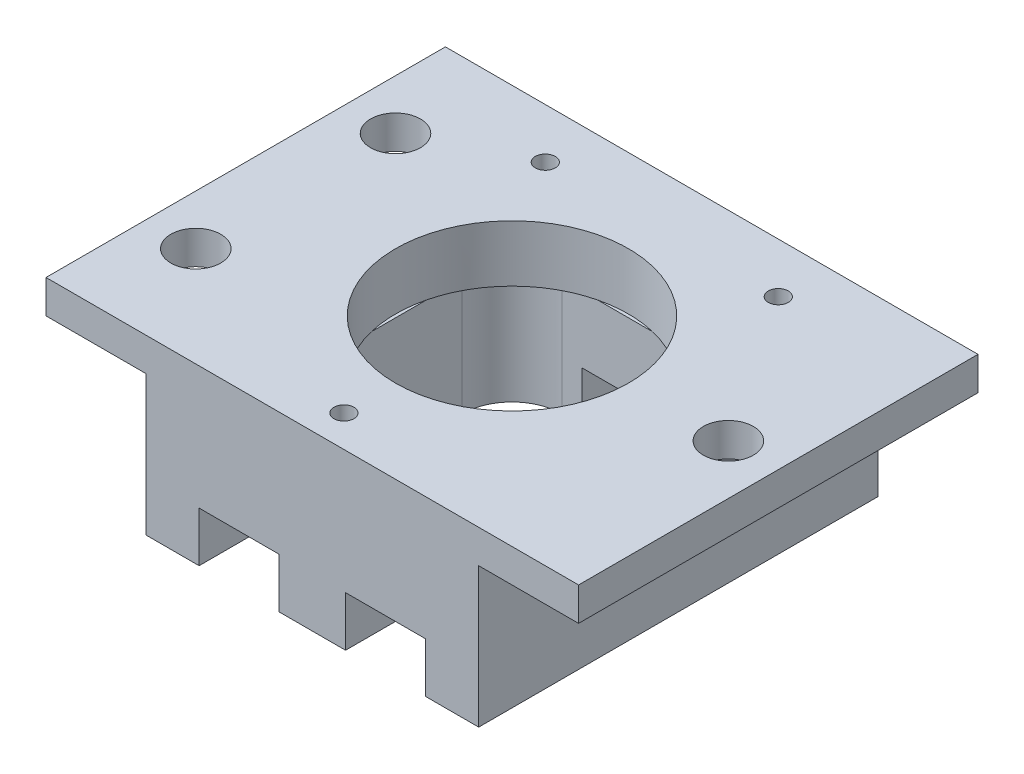
ISO-10303-21;
HEADER;
FILE_DESCRIPTION(('STEP AP214'),'2;1');
FILE_NAME('part.step','',(''),(''),'','','');
FILE_SCHEMA(('AUTOMOTIVE_DESIGN { 1 0 10303 214 1 1 1 1 }'));
ENDSEC;
DATA;
#1=APPLICATION_CONTEXT('core data for automotive mechanical design processes');
#2=APPLICATION_PROTOCOL_DEFINITION('international standard','automotive_design',2000,#1);
#3=PRODUCT_CONTEXT('',#1,'mechanical');
#4=PRODUCT('Part','Part','',(#3));
#5=PRODUCT_RELATED_PRODUCT_CATEGORY('part','',(#4));
#6=PRODUCT_DEFINITION_FORMATION('','',#4);
#7=PRODUCT_DEFINITION_CONTEXT('part definition',#1,'design');
#8=PRODUCT_DEFINITION('design','',#6,#7);
#9=PRODUCT_DEFINITION_SHAPE('','',#8);
#10=(LENGTH_UNIT() NAMED_UNIT(*) SI_UNIT(.MILLI.,.METRE.));
#11=(NAMED_UNIT(*) PLANE_ANGLE_UNIT() SI_UNIT($,.RADIAN.));
#12=(NAMED_UNIT(*) SI_UNIT($,.STERADIAN.) SOLID_ANGLE_UNIT());
#13=UNCERTAINTY_MEASURE_WITH_UNIT(LENGTH_MEASURE(1.E-05),#10,'distance_accuracy_value','');
#14=(GEOMETRIC_REPRESENTATION_CONTEXT(3) GLOBAL_UNCERTAINTY_ASSIGNED_CONTEXT((#13)) GLOBAL_UNIT_ASSIGNED_CONTEXT((#10,
#11,#12)) REPRESENTATION_CONTEXT('',''));
#15=CARTESIAN_POINT('',(0.,0.,0.));
#16=DIRECTION('',(0.,0.,1.));
#17=DIRECTION('',(1.,0.,0.));
#18=AXIS2_PLACEMENT_3D('',#15,#16,#17);
#19=CARTESIAN_POINT('',(0.,-3.5,0.));
#20=DIRECTION('',(0.,1.,0.));
#21=DIRECTION('',(0.,0.,1.));
#22=AXIS2_PLACEMENT_3D('',#19,#20,#21);
#23=PLANE('',#22);
#24=CARTESIAN_POINT('',(3.5,-3.5,-4.5));
#25=DIRECTION('',(0.,1.,0.));
#26=DIRECTION('',(0.,0.,1.));
#27=AXIS2_PLACEMENT_3D('',#24,#25,#26);
#28=CIRCLE('',#27,0.299999999999997);
#29=CARTESIAN_POINT('',(3.5,-3.5,-4.2));
#30=VERTEX_POINT('',#29);
#31=EDGE_CURVE('E311',#30,#30,#28,.T.);
#32=ORIENTED_EDGE('',*,*,#31,.T.);
#33=EDGE_LOOP('',(#32));
#34=FACE_BOUND('',#33,.T.);
#35=DIRECTION('',(0.,0.,-1.));
#36=VECTOR('',#35,1.);
#37=CARTESIAN_POINT('',(1.3,-3.5,0.));
#38=LINE('',#37,#36);
#39=CARTESIAN_POINT('',(1.3,-3.5,-3.4));
#40=VERTEX_POINT('',#39);
#41=CARTESIAN_POINT('',(1.3,-3.5,-6.));
#42=VERTEX_POINT('',#41);
#43=EDGE_CURVE('E308',#40,#42,#38,.T.);
#44=ORIENTED_EDGE('',*,*,#43,.T.);
#45=DIRECTION('',(1.,0.,0.));
#46=VECTOR('',#45,1.);
#47=CARTESIAN_POINT('',(-5.,-3.5,-6.));
#48=LINE('',#47,#46);
#49=CARTESIAN_POINT('',(5.,-3.5,-6.));
#50=VERTEX_POINT('',#49);
#51=EDGE_CURVE('E435',#42,#50,#48,.T.);
#52=ORIENTED_EDGE('',*,*,#51,.T.);
#53=DIRECTION('',(0.,0.,-1.));
#54=VECTOR('',#53,1.);
#55=CARTESIAN_POINT('',(5.,-3.5,6.));
#56=LINE('',#55,#54);
#57=CARTESIAN_POINT('',(5.,-3.5,6.));
#58=VERTEX_POINT('',#57);
#59=EDGE_CURVE('E431',#58,#50,#56,.T.);
#60=ORIENTED_EDGE('',*,*,#59,.F.);
#61=DIRECTION('',(1.,0.,0.));
#62=VECTOR('',#61,1.);
#63=CARTESIAN_POINT('',(-5.,-3.5,6.));
#64=LINE('',#63,#62);
#65=CARTESIAN_POINT('',(3.4,-3.5,6.));
#66=VERTEX_POINT('',#65);
#67=EDGE_CURVE('E427',#66,#58,#64,.T.);
#68=ORIENTED_EDGE('',*,*,#67,.F.);
#69=DIRECTION('',(0.,0.,1.));
#70=VECTOR('',#69,1.);
#71=CARTESIAN_POINT('',(3.4,-3.5,0.));
#72=LINE('',#71,#70);
#73=CARTESIAN_POINT('',(3.4,-3.5,-1.9));
#74=VERTEX_POINT('',#73);
#75=EDGE_CURVE('E270',#74,#66,#72,.T.);
#76=ORIENTED_EDGE('',*,*,#75,.F.);
#77=CARTESIAN_POINT('',(1.9,-3.5,-1.9));
#78=DIRECTION('',(0.,-1.,0.));
#79=DIRECTION('',(0.,0.,-1.));
#80=AXIS2_PLACEMENT_3D('',#77,#78,#79);
#81=CIRCLE('',#80,1.5);
#82=CARTESIAN_POINT('',(1.9,-3.5,-3.4));
#83=VERTEX_POINT('',#82);
#84=EDGE_CURVE('E391',#83,#74,#81,.T.);
#85=ORIENTED_EDGE('',*,*,#84,.F.);
#86=DIRECTION('',(-1.,0.,0.));
#87=VECTOR('',#86,1.);
#88=CARTESIAN_POINT('',(0.,-3.5,-3.4));
#89=LINE('',#88,#87);
#90=EDGE_CURVE('E388',#83,#40,#89,.T.);
#91=ORIENTED_EDGE('',*,*,#90,.T.);
#92=EDGE_LOOP('',(#44,#52,#60,#68,#76,#85,#91));
#93=FACE_BOUND('',#92,.T.);
#94=ADVANCED_FACE('F80',(#34,#93),#23,.F.);
#95=CARTESIAN_POINT('',(0.,-3.5,5.05));
#96=DIRECTION('',(0.,1.,0.));
#97=DIRECTION('',(0.,0.,1.));
#98=AXIS2_PLACEMENT_3D('',#95,#96,#97);
#99=CIRCLE('',#98,0.3);
#100=CARTESIAN_POINT('',(0.,-3.5,5.35));
#101=VERTEX_POINT('',#100);
#102=EDGE_CURVE('E471',#101,#101,#99,.T.);
#103=ORIENTED_EDGE('',*,*,#102,.T.);
#104=EDGE_LOOP('',(#103));
#105=FACE_BOUND('',#104,.T.);
#106=DIRECTION('',(0.,0.,1.));
#107=VECTOR('',#106,1.);
#108=CARTESIAN_POINT('',(1.,-3.5,0.));
#109=LINE('',#108,#107);
#110=CARTESIAN_POINT('',(1.,-3.5,4.1));
#111=VERTEX_POINT('',#110);
#112=CARTESIAN_POINT('',(1.,-3.5,6.));
#113=VERTEX_POINT('',#112);
#114=EDGE_CURVE('E281',#111,#113,#109,.T.);
#115=ORIENTED_EDGE('',*,*,#114,.T.);
#116=CARTESIAN_POINT('',(-1.,-3.5,6.));
#117=VERTEX_POINT('',#116);
#118=EDGE_CURVE('E432',#117,#113,#64,.T.);
#119=ORIENTED_EDGE('',*,*,#118,.F.);
#120=DIRECTION('',(0.,0.,1.));
#121=VECTOR('',#120,1.);
#122=CARTESIAN_POINT('',(-1.,-3.5,0.));
#123=LINE('',#122,#121);
#124=CARTESIAN_POINT('',(-1.,-3.5,4.1));
#125=VERTEX_POINT('',#124);
#126=EDGE_CURVE('E296',#125,#117,#123,.T.);
#127=ORIENTED_EDGE('',*,*,#126,.F.);
#128=DIRECTION('',(-1.,0.,0.));
#129=VECTOR('',#128,1.);
#130=CARTESIAN_POINT('',(0.,-3.5,4.1));
#131=LINE('',#130,#129);
#132=EDGE_CURVE('E394',#111,#125,#131,.T.);
#133=ORIENTED_EDGE('',*,*,#132,.F.);
#134=EDGE_LOOP('',(#115,#119,#127,#133));
#135=FACE_BOUND('',#134,.T.);
#136=ADVANCED_FACE('F555',(#105,#135),#23,.F.);
#137=CARTESIAN_POINT('',(0.,-3.5,4.1));
#138=DIRECTION('',(0.,0.,-1.));
#139=DIRECTION('',(-1.,0.,0.));
#140=AXIS2_PLACEMENT_3D('',#137,#138,#139);
#141=PLANE('',#140);
#142=DIRECTION('',(-1.,0.,0.));
#143=VECTOR('',#142,1.);
#144=CARTESIAN_POINT('',(0.,-2.,4.1));
#145=LINE('',#144,#143);
#146=CARTESIAN_POINT('',(3.4,-2.,4.1));
#147=VERTEX_POINT('',#146);
#148=CARTESIAN_POINT('',(1.,-2.,4.1));
#149=VERTEX_POINT('',#148);
#150=EDGE_CURVE('E275',#147,#149,#145,.T.);
#151=ORIENTED_EDGE('',*,*,#150,.T.);
#152=DIRECTION('',(0.,-1.,0.));
#153=VECTOR('',#152,1.);
#154=CARTESIAN_POINT('',(1.,-2.,4.1));
#155=LINE('',#154,#153);
#156=EDGE_CURVE('E293',#149,#111,#155,.T.);
#157=ORIENTED_EDGE('',*,*,#156,.T.);
#158=ORIENTED_EDGE('',*,*,#132,.T.);
#159=DIRECTION('',(0.,-1.,0.));
#160=VECTOR('',#159,1.);
#161=CARTESIAN_POINT('',(-1.,-2.,4.1));
#162=LINE('',#161,#160);
#163=CARTESIAN_POINT('',(-1.,-2.,4.1));
#164=VERTEX_POINT('',#163);
#165=EDGE_CURVE('E338',#164,#125,#162,.T.);
#166=ORIENTED_EDGE('',*,*,#165,.F.);
#167=DIRECTION('',(-1.,0.,0.));
#168=VECTOR('',#167,1.);
#169=CARTESIAN_POINT('',(0.,-2.,4.1));
#170=LINE('',#169,#168);
#171=CARTESIAN_POINT('',(-3.4,-2.,4.1));
#172=VERTEX_POINT('',#171);
#173=EDGE_CURVE('E326',#164,#172,#170,.T.);
#174=ORIENTED_EDGE('',*,*,#173,.T.);
#175=DIRECTION('',(0.,1.,0.));
#176=VECTOR('',#175,1.);
#177=CARTESIAN_POINT('',(-3.4,-3.5,4.1));
#178=LINE('',#177,#176);
#179=CARTESIAN_POINT('',(-3.4,0.,4.1));
#180=VERTEX_POINT('',#179);
#181=EDGE_CURVE('E397',#172,#180,#178,.T.);
#182=ORIENTED_EDGE('',*,*,#181,.T.);
#183=DIRECTION('',(-1.,0.,0.));
#184=VECTOR('',#183,1.);
#185=CARTESIAN_POINT('',(0.,0.,4.1));
#186=LINE('',#185,#184);
#187=CARTESIAN_POINT('',(3.4,0.,4.1));
#188=VERTEX_POINT('',#187);
#189=EDGE_CURVE('E384',#188,#180,#186,.T.);
#190=ORIENTED_EDGE('',*,*,#189,.F.);
#191=DIRECTION('',(0.,1.,0.));
#192=VECTOR('',#191,1.);
#193=CARTESIAN_POINT('',(3.4,-3.5,4.1));
#194=LINE('',#193,#192);
#195=EDGE_CURVE('E416',#147,#188,#194,.T.);
#196=ORIENTED_EDGE('',*,*,#195,.F.);
#197=EDGE_LOOP('',(#151,#157,#158,#166,#174,#182,#190,#196));
#198=FACE_BOUND('',#197,.T.);
#199=ADVANCED_FACE('F560',(#198),#141,.T.);
#200=CARTESIAN_POINT('',(-5.,1.7,6.));
#201=DIRECTION('',(-1.,0.,0.));
#202=DIRECTION('',(0.,0.,1.));
#203=AXIS2_PLACEMENT_3D('',#200,#201,#202);
#204=PLANE('',#203);
#205=DIRECTION('',(0.,-1.,0.));
#206=VECTOR('',#205,1.);
#207=CARTESIAN_POINT('',(-5.,1.7,6.));
#208=LINE('',#207,#206);
#209=CARTESIAN_POINT('',(-5.,0.7,6.));
#210=VERTEX_POINT('',#209);
#211=CARTESIAN_POINT('',(-5.,-3.5,6.));
#212=VERTEX_POINT('',#211);
#213=EDGE_CURVE('E454',#210,#212,#208,.T.);
#214=ORIENTED_EDGE('',*,*,#213,.F.);
#215=DIRECTION('',(0.,0.,-1.));
#216=VECTOR('',#215,1.);
#217=CARTESIAN_POINT('',(-5.,0.7,0.));
#218=LINE('',#217,#216);
#219=CARTESIAN_POINT('',(-5.,0.7,-6.));
#220=VERTEX_POINT('',#219);
#221=EDGE_CURVE('E365',#210,#220,#218,.T.);
#222=ORIENTED_EDGE('',*,*,#221,.T.);
#223=DIRECTION('',(0.,-1.,0.));
#224=VECTOR('',#223,1.);
#225=CARTESIAN_POINT('',(-5.,1.7,-6.));
#226=LINE('',#225,#224);
#227=CARTESIAN_POINT('',(-5.,-3.5,-6.));
#228=VERTEX_POINT('',#227);
#229=EDGE_CURVE('E453',#220,#228,#226,.T.);
#230=ORIENTED_EDGE('',*,*,#229,.T.);
#231=DIRECTION('',(0.,0.,-1.));
#232=VECTOR('',#231,1.);
#233=CARTESIAN_POINT('',(-5.,-3.5,6.));
#234=LINE('',#233,#232);
#235=EDGE_CURVE('E439',#212,#228,#234,.T.);
#236=ORIENTED_EDGE('',*,*,#235,.F.);
#237=EDGE_LOOP('',(#214,#222,#230,#236));
#238=FACE_BOUND('',#237,.T.);
#239=ADVANCED_FACE('F82',(#238),#204,.T.);
#240=CARTESIAN_POINT('',(0.,0.,0.));
#241=DIRECTION('',(0.,-1.,0.));
#242=DIRECTION('',(0.,0.,-1.));
#243=AXIS2_PLACEMENT_3D('',#240,#241,#242);
#244=PLANE('',#243);
#245=DIRECTION('',(0.,0.,1.));
#246=VECTOR('',#245,1.);
#247=CARTESIAN_POINT('',(-3.4,0.,0.));
#248=LINE('',#247,#246);
#249=CARTESIAN_POINT('',(-3.4,0.,-1.9));
#250=VERTEX_POINT('',#249);
#251=CARTESIAN_POINT('',(-3.4,0.,-0.830662386291808));
#252=VERTEX_POINT('',#251);
#253=EDGE_CURVE('E398',#250,#252,#248,.T.);
#254=ORIENTED_EDGE('',*,*,#253,.F.);
#255=CARTESIAN_POINT('',(-1.9,0.,-1.9));
#256=DIRECTION('',(0.,-1.,0.));
#257=DIRECTION('',(0.,0.,-1.));
#258=AXIS2_PLACEMENT_3D('',#255,#256,#257);
#259=CIRCLE('',#258,1.5);
#260=CARTESIAN_POINT('',(-1.9,0.,-3.4));
#261=VERTEX_POINT('',#260);
#262=EDGE_CURVE('E401',#250,#261,#259,.T.);
#263=ORIENTED_EDGE('',*,*,#262,.T.);
#264=DIRECTION('',(-1.,0.,0.));
#265=VECTOR('',#264,1.);
#266=CARTESIAN_POINT('',(0.,0.,-3.4));
#267=LINE('',#266,#265);
#268=CARTESIAN_POINT('',(-0.830662386291807,0.,-3.4));
#269=VERTEX_POINT('',#268);
#270=EDGE_CURVE('E12',#269,#261,#267,.T.);
#271=ORIENTED_EDGE('',*,*,#270,.F.);
#272=CARTESIAN_POINT('',(0.,0.,0.));
#273=DIRECTION('',(0.,1.,0.));
#274=DIRECTION('',(0.,0.,1.));
#275=AXIS2_PLACEMENT_3D('',#272,#273,#274);
#276=CIRCLE('',#275,3.5);
#277=EDGE_CURVE('E576',#269,#252,#276,.T.);
#278=ORIENTED_EDGE('',*,*,#277,.T.);
#279=EDGE_LOOP('',(#254,#263,#271,#278));
#280=FACE_BOUND('',#279,.T.);
#281=ADVANCED_FACE('F587',(#280),#244,.T.);
#282=CARTESIAN_POINT('',(1.9,0.,-3.4));
#283=VERTEX_POINT('',#282);
#284=CARTESIAN_POINT('',(0.830662386291808,0.,-3.4));
#285=VERTEX_POINT('',#284);
#286=EDGE_CURVE('E91',#283,#285,#267,.T.);
#287=ORIENTED_EDGE('',*,*,#286,.F.);
#288=CARTESIAN_POINT('',(1.9,0.,-1.9));
#289=DIRECTION('',(0.,-1.,0.));
#290=DIRECTION('',(0.,0.,-1.));
#291=AXIS2_PLACEMENT_3D('',#288,#289,#290);
#292=CIRCLE('',#291,1.5);
#293=CARTESIAN_POINT('',(3.4,0.,-1.9));
#294=VERTEX_POINT('',#293);
#295=EDGE_CURVE('E405',#283,#294,#292,.T.);
#296=ORIENTED_EDGE('',*,*,#295,.T.);
#297=DIRECTION('',(0.,0.,1.));
#298=VECTOR('',#297,1.);
#299=CARTESIAN_POINT('',(3.4,0.,0.));
#300=LINE('',#299,#298);
#301=CARTESIAN_POINT('',(3.4,0.,-0.830662386291809));
#302=VERTEX_POINT('',#301);
#303=EDGE_CURVE('E409',#294,#302,#300,.T.);
#304=ORIENTED_EDGE('',*,*,#303,.T.);
#305=EDGE_CURVE('E449',#302,#285,#276,.T.);
#306=ORIENTED_EDGE('',*,*,#305,.T.);
#307=EDGE_LOOP('',(#287,#296,#304,#306));
#308=FACE_BOUND('',#307,.T.);
#309=ADVANCED_FACE('F508',(#308),#244,.T.);
#310=CARTESIAN_POINT('',(0.,1.7,0.));
#311=DIRECTION('',(0.,-1.,0.));
#312=DIRECTION('',(0.,0.,-1.));
#313=AXIS2_PLACEMENT_3D('',#310,#311,#312);
#314=PLANE('',#313);
#315=CARTESIAN_POINT('',(6.5,1.7,0.));
#316=DIRECTION('',(0.,1.,0.));
#317=DIRECTION('',(0.,0.,1.));
#318=AXIS2_PLACEMENT_3D('',#315,#316,#317);
#319=CIRCLE('',#318,0.750000000000001);
#320=CARTESIAN_POINT('',(6.5,1.7,0.750000000000001));
#321=VERTEX_POINT('',#320);
#322=EDGE_CURVE('E466',#321,#321,#319,.T.);
#323=ORIENTED_EDGE('',*,*,#322,.F.);
#324=EDGE_LOOP('',(#323));
#325=FACE_BOUND('',#324,.T.);
#326=CARTESIAN_POINT('',(-6.5,1.7,-3.));
#327=DIRECTION('',(0.,1.,0.));
#328=DIRECTION('',(0.,0.,1.));
#329=AXIS2_PLACEMENT_3D('',#326,#327,#328);
#330=CIRCLE('',#329,0.750000000000001);
#331=CARTESIAN_POINT('',(-6.5,1.7,-2.25));
#332=VERTEX_POINT('',#331);
#333=EDGE_CURVE('E495',#332,#332,#330,.T.);
#334=ORIENTED_EDGE('',*,*,#333,.F.);
#335=EDGE_LOOP('',(#334));
#336=FACE_BOUND('',#335,.T.);
#337=CARTESIAN_POINT('',(-6.5,1.7,3.));
#338=DIRECTION('',(0.,1.,0.));
#339=DIRECTION('',(0.,0.,1.));
#340=AXIS2_PLACEMENT_3D('',#337,#338,#339);
#341=CIRCLE('',#340,0.750000000000001);
#342=CARTESIAN_POINT('',(-6.5,1.7,3.75));
#343=VERTEX_POINT('',#342);
#344=EDGE_CURVE('E492',#343,#343,#341,.T.);
#345=ORIENTED_EDGE('',*,*,#344,.F.);
#346=EDGE_LOOP('',(#345));
#347=FACE_BOUND('',#346,.T.);
#348=CARTESIAN_POINT('',(3.5,1.7,-4.5));
#349=DIRECTION('',(0.,1.,0.));
#350=DIRECTION('',(0.,0.,1.));
#351=AXIS2_PLACEMENT_3D('',#348,#349,#350);
#352=CIRCLE('',#351,0.299999999999997);
#353=CARTESIAN_POINT('',(3.5,1.7,-4.2));
#354=VERTEX_POINT('',#353);
#355=EDGE_CURVE('E489',#354,#354,#352,.T.);
#356=ORIENTED_EDGE('',*,*,#355,.F.);
#357=EDGE_LOOP('',(#356));
#358=FACE_BOUND('',#357,.T.);
#359=CARTESIAN_POINT('',(-3.5,1.7,-4.5));
#360=DIRECTION('',(0.,1.,0.));
#361=DIRECTION('',(0.,0.,1.));
#362=AXIS2_PLACEMENT_3D('',#359,#360,#361);
#363=CIRCLE('',#362,0.3);
#364=CARTESIAN_POINT('',(-3.5,1.7,-4.2));
#365=VERTEX_POINT('',#364);
#366=EDGE_CURVE('E486',#365,#365,#363,.T.);
#367=ORIENTED_EDGE('',*,*,#366,.F.);
#368=EDGE_LOOP('',(#367));
#369=FACE_BOUND('',#368,.T.);
#370=CARTESIAN_POINT('',(0.,1.7,5.05));
#371=DIRECTION('',(0.,1.,0.));
#372=DIRECTION('',(0.,0.,1.));
#373=AXIS2_PLACEMENT_3D('',#370,#371,#372);
#374=CIRCLE('',#373,0.3);
#375=CARTESIAN_POINT('',(0.,1.7,5.35));
#376=VERTEX_POINT('',#375);
#377=EDGE_CURVE('E483',#376,#376,#374,.T.);
#378=ORIENTED_EDGE('',*,*,#377,.F.);
#379=EDGE_LOOP('',(#378));
#380=FACE_BOUND('',#379,.T.);
#381=DIRECTION('',(1.,0.,0.));
#382=VECTOR('',#381,1.);
#383=CARTESIAN_POINT('',(-5.,1.7,-6.));
#384=LINE('',#383,#382);
#385=CARTESIAN_POINT('',(-8.,1.7,-6.));
#386=VERTEX_POINT('',#385);
#387=CARTESIAN_POINT('',(8.,1.7,-6.));
#388=VERTEX_POINT('',#387);
#389=EDGE_CURVE('E446',#386,#388,#384,.T.);
#390=ORIENTED_EDGE('',*,*,#389,.F.);
#391=DIRECTION('',(0.,0.,-1.));
#392=VECTOR('',#391,1.);
#393=CARTESIAN_POINT('',(-8.,1.7,0.));
#394=LINE('',#393,#392);
#395=CARTESIAN_POINT('',(-8.,1.7,6.));
#396=VERTEX_POINT('',#395);
#397=EDGE_CURVE('E361',#396,#386,#394,.T.);
#398=ORIENTED_EDGE('',*,*,#397,.F.);
#399=DIRECTION('',(1.,0.,0.));
#400=VECTOR('',#399,1.);
#401=CARTESIAN_POINT('',(-5.,1.7,6.));
#402=LINE('',#401,#400);
#403=CARTESIAN_POINT('',(8.,1.7,6.));
#404=VERTEX_POINT('',#403);
#405=EDGE_CURVE('E451',#396,#404,#402,.T.);
#406=ORIENTED_EDGE('',*,*,#405,.T.);
#407=DIRECTION('',(0.,0.,-1.));
#408=VECTOR('',#407,1.);
#409=CARTESIAN_POINT('',(8.,1.7,0.));
#410=LINE('',#409,#408);
#411=EDGE_CURVE('E337',#404,#388,#410,.T.);
#412=ORIENTED_EDGE('',*,*,#411,.T.);
#413=EDGE_LOOP('',(#390,#398,#406,#412));
#414=FACE_BOUND('',#413,.T.);
#415=CARTESIAN_POINT('',(0.,1.7,0.));
#416=DIRECTION('',(0.,1.,0.));
#417=DIRECTION('',(0.,0.,1.));
#418=AXIS2_PLACEMENT_3D('',#415,#416,#417);
#419=CIRCLE('',#418,3.5);
#420=CARTESIAN_POINT('',(0.,1.7,3.5));
#421=VERTEX_POINT('',#420);
#422=EDGE_CURVE('E443',#421,#421,#419,.T.);
#423=ORIENTED_EDGE('',*,*,#422,.F.);
#424=EDGE_LOOP('',(#423));
#425=FACE_BOUND('',#424,.T.);
#426=ADVANCED_FACE('F504',(#325,#336,#347,#358,#369,#380,#414,#425),#314,.F.);
#427=CARTESIAN_POINT('',(-3.4,0.,0.830662386291809));
#428=VERTEX_POINT('',#427);
#429=EDGE_CURVE('E89',#428,#180,#248,.T.);
#430=ORIENTED_EDGE('',*,*,#429,.F.);
#431=CARTESIAN_POINT('',(3.4,0.,0.830662386291809));
#432=VERTEX_POINT('',#431);
#433=EDGE_CURVE('E442',#428,#432,#276,.T.);
#434=ORIENTED_EDGE('',*,*,#433,.T.);
#435=EDGE_CURVE('E412',#432,#188,#300,.T.);
#436=ORIENTED_EDGE('',*,*,#435,.T.);
#437=ORIENTED_EDGE('',*,*,#189,.T.);
#438=EDGE_LOOP('',(#430,#434,#436,#437));
#439=FACE_BOUND('',#438,.T.);
#440=ADVANCED_FACE('F507',(#439),#244,.T.);
#441=CARTESIAN_POINT('',(-5.,1.7,6.));
#442=DIRECTION('',(0.,0.,-1.));
#443=DIRECTION('',(-1.,0.,0.));
#444=AXIS2_PLACEMENT_3D('',#441,#442,#443);
#445=PLANE('',#444);
#446=DIRECTION('',(-1.,0.,0.));
#447=VECTOR('',#446,1.);
#448=CARTESIAN_POINT('',(0.,-2.,6.));
#449=LINE('',#448,#447);
#450=CARTESIAN_POINT('',(3.4,-2.,6.));
#451=VERTEX_POINT('',#450);
#452=CARTESIAN_POINT('',(1.,-2.,6.));
#453=VERTEX_POINT('',#452);
#454=EDGE_CURVE('E278',#451,#453,#449,.T.);
#455=ORIENTED_EDGE('',*,*,#454,.F.);
#456=DIRECTION('',(0.,-1.,0.));
#457=VECTOR('',#456,1.);
#458=CARTESIAN_POINT('',(3.4,-2.,6.));
#459=LINE('',#458,#457);
#460=EDGE_CURVE('E262',#451,#66,#459,.T.);
#461=ORIENTED_EDGE('',*,*,#460,.T.);
#462=ORIENTED_EDGE('',*,*,#67,.T.);
#463=DIRECTION('',(0.,-1.,0.));
#464=VECTOR('',#463,1.);
#465=CARTESIAN_POINT('',(5.,1.7,6.));
#466=LINE('',#465,#464);
#467=CARTESIAN_POINT('',(5.,0.7,6.));
#468=VERTEX_POINT('',#467);
#469=EDGE_CURVE('E456',#468,#58,#466,.T.);
#470=ORIENTED_EDGE('',*,*,#469,.F.);
#471=DIRECTION('',(1.,0.,0.));
#472=VECTOR('',#471,1.);
#473=CARTESIAN_POINT('',(0.,0.7,6.));
#474=LINE('',#473,#472);
#475=CARTESIAN_POINT('',(8.,0.7,6.));
#476=VERTEX_POINT('',#475);
#477=EDGE_CURVE('E347',#468,#476,#474,.T.);
#478=ORIENTED_EDGE('',*,*,#477,.T.);
#479=DIRECTION('',(0.,1.,0.));
#480=VECTOR('',#479,1.);
#481=CARTESIAN_POINT('',(8.,0.7,6.));
#482=LINE('',#481,#480);
#483=EDGE_CURVE('E353',#476,#404,#482,.T.);
#484=ORIENTED_EDGE('',*,*,#483,.T.);
#485=ORIENTED_EDGE('',*,*,#405,.F.);
#486=DIRECTION('',(0.,1.,0.));
#487=VECTOR('',#486,1.);
#488=CARTESIAN_POINT('',(-8.,0.7,6.));
#489=LINE('',#488,#487);
#490=CARTESIAN_POINT('',(-8.,0.7,6.));
#491=VERTEX_POINT('',#490);
#492=EDGE_CURVE('E375',#491,#396,#489,.T.);
#493=ORIENTED_EDGE('',*,*,#492,.F.);
#494=DIRECTION('',(1.,0.,0.));
#495=VECTOR('',#494,1.);
#496=CARTESIAN_POINT('',(0.,0.7,6.));
#497=LINE('',#496,#495);
#498=EDGE_CURVE('E362',#491,#210,#497,.T.);
#499=ORIENTED_EDGE('',*,*,#498,.T.);
#500=ORIENTED_EDGE('',*,*,#213,.T.);
#501=CARTESIAN_POINT('',(-3.4,-3.5,6.));
#502=VERTEX_POINT('',#501);
#503=EDGE_CURVE('E428',#212,#502,#64,.T.);
#504=ORIENTED_EDGE('',*,*,#503,.T.);
#505=DIRECTION('',(0.,-1.,0.));
#506=VECTOR('',#505,1.);
#507=CARTESIAN_POINT('',(-3.4,-2.,6.));
#508=LINE('',#507,#506);
#509=CARTESIAN_POINT('',(-3.4,-2.,6.));
#510=VERTEX_POINT('',#509);
#511=EDGE_CURVE('E332',#510,#502,#508,.T.);
#512=ORIENTED_EDGE('',*,*,#511,.F.);
#513=DIRECTION('',(-1.,0.,0.));
#514=VECTOR('',#513,1.);
#515=CARTESIAN_POINT('',(0.,-2.,6.));
#516=LINE('',#515,#514);
#517=CARTESIAN_POINT('',(-1.,-2.,6.));
#518=VERTEX_POINT('',#517);
#519=EDGE_CURVE('E321',#518,#510,#516,.T.);
#520=ORIENTED_EDGE('',*,*,#519,.F.);
#521=DIRECTION('',(0.,-1.,0.));
#522=VECTOR('',#521,1.);
#523=CARTESIAN_POINT('',(-1.,-2.,6.));
#524=LINE('',#523,#522);
#525=EDGE_CURVE('E334',#518,#117,#524,.T.);
#526=ORIENTED_EDGE('',*,*,#525,.T.);
#527=ORIENTED_EDGE('',*,*,#118,.T.);
#528=DIRECTION('',(0.,-1.,0.));
#529=VECTOR('',#528,1.);
#530=CARTESIAN_POINT('',(1.,-2.,6.));
#531=LINE('',#530,#529);
#532=EDGE_CURVE('E274',#453,#113,#531,.T.);
#533=ORIENTED_EDGE('',*,*,#532,.F.);
#534=EDGE_LOOP('',(#455,#461,#462,#470,#478,#484,#485,#493,#499,#500,#504,#512,#520,#526,#527,#533));
#535=FACE_BOUND('',#534,.T.);
#536=ADVANCED_FACE('F283',(#535),#445,.F.);
#537=CARTESIAN_POINT('',(5.,1.7,6.));
#538=DIRECTION('',(-1.,0.,0.));
#539=DIRECTION('',(0.,0.,1.));
#540=AXIS2_PLACEMENT_3D('',#537,#538,#539);
#541=PLANE('',#540);
#542=DIRECTION('',(0.,-1.,0.));
#543=VECTOR('',#542,1.);
#544=CARTESIAN_POINT('',(5.,1.7,-6.));
#545=LINE('',#544,#543);
#546=CARTESIAN_POINT('',(5.,0.7,-6.));
#547=VERTEX_POINT('',#546);
#548=EDGE_CURVE('E459',#547,#50,#545,.T.);
#549=ORIENTED_EDGE('',*,*,#548,.F.);
#550=DIRECTION('',(0.,0.,1.));
#551=VECTOR('',#550,1.);
#552=CARTESIAN_POINT('',(5.,0.7,0.));
#553=LINE('',#552,#551);
#554=EDGE_CURVE('E350',#547,#468,#553,.T.);
#555=ORIENTED_EDGE('',*,*,#554,.T.);
#556=ORIENTED_EDGE('',*,*,#469,.T.);
#557=ORIENTED_EDGE('',*,*,#59,.T.);
#558=EDGE_LOOP('',(#549,#555,#556,#557));
#559=FACE_BOUND('',#558,.T.);
#560=ADVANCED_FACE('F613',(#559),#541,.F.);
#561=CARTESIAN_POINT('',(-5.,1.7,-6.));
#562=DIRECTION('',(0.,0.,-1.));
#563=DIRECTION('',(-1.,0.,0.));
#564=AXIS2_PLACEMENT_3D('',#561,#562,#563);
#565=PLANE('',#564);
#566=DIRECTION('',(0.,-1.,0.));
#567=VECTOR('',#566,1.);
#568=CARTESIAN_POINT('',(-1.3,-2.,-6.));
#569=LINE('',#568,#567);
#570=CARTESIAN_POINT('',(-1.3,-2.,-6.));
#571=VERTEX_POINT('',#570);
#572=CARTESIAN_POINT('',(-1.3,-3.5,-6.));
#573=VERTEX_POINT('',#572);
#574=EDGE_CURVE('E292',#571,#573,#569,.T.);
#575=ORIENTED_EDGE('',*,*,#574,.T.);
#576=EDGE_CURVE('E436',#228,#573,#48,.T.);
#577=ORIENTED_EDGE('',*,*,#576,.F.);
#578=ORIENTED_EDGE('',*,*,#229,.F.);
#579=DIRECTION('',(1.,0.,0.));
#580=VECTOR('',#579,1.);
#581=CARTESIAN_POINT('',(0.,0.7,-6.));
#582=LINE('',#581,#580);
#583=CARTESIAN_POINT('',(-8.,0.7,-6.));
#584=VERTEX_POINT('',#583);
#585=EDGE_CURVE('E368',#584,#220,#582,.T.);
#586=ORIENTED_EDGE('',*,*,#585,.F.);
#587=DIRECTION('',(0.,1.,0.));
#588=VECTOR('',#587,1.);
#589=CARTESIAN_POINT('',(-8.,0.7,-6.));
#590=LINE('',#589,#588);
#591=EDGE_CURVE('E372',#584,#386,#590,.T.);
#592=ORIENTED_EDGE('',*,*,#591,.T.);
#593=ORIENTED_EDGE('',*,*,#389,.T.);
#594=DIRECTION('',(0.,1.,0.));
#595=VECTOR('',#594,1.);
#596=CARTESIAN_POINT('',(8.,0.7,-6.));
#597=LINE('',#596,#595);
#598=CARTESIAN_POINT('',(8.,0.7,-6.));
#599=VERTEX_POINT('',#598);
#600=EDGE_CURVE('E358',#599,#388,#597,.T.);
#601=ORIENTED_EDGE('',*,*,#600,.F.);
#602=DIRECTION('',(1.,0.,0.));
#603=VECTOR('',#602,1.);
#604=CARTESIAN_POINT('',(0.,0.7,-6.));
#605=LINE('',#604,#603);
#606=EDGE_CURVE('E342',#547,#599,#605,.T.);
#607=ORIENTED_EDGE('',*,*,#606,.F.);
#608=ORIENTED_EDGE('',*,*,#548,.T.);
#609=ORIENTED_EDGE('',*,*,#51,.F.);
#610=DIRECTION('',(0.,-1.,0.));
#611=VECTOR('',#610,1.);
#612=CARTESIAN_POINT('',(1.3,-2.,-6.));
#613=LINE('',#612,#611);
#614=CARTESIAN_POINT('',(1.3,-2.,-6.));
#615=VERTEX_POINT('',#614);
#616=EDGE_CURVE('E307',#615,#42,#613,.T.);
#617=ORIENTED_EDGE('',*,*,#616,.F.);
#618=DIRECTION('',(1.,0.,0.));
#619=VECTOR('',#618,1.);
#620=CARTESIAN_POINT('',(0.,-2.,-6.));
#621=LINE('',#620,#619);
#622=EDGE_CURVE('E298',#571,#615,#621,.T.);
#623=ORIENTED_EDGE('',*,*,#622,.F.);
#624=EDGE_LOOP('',(#575,#577,#578,#586,#592,#593,#601,#607,#608,#609,#617,#623));
#625=FACE_BOUND('',#624,.T.);
#626=ADVANCED_FACE('F528',(#625),#565,.T.);
#627=CARTESIAN_POINT('',(0.,1.7,0.));
#628=DIRECTION('',(0.,-1.,0.));
#629=DIRECTION('',(0.,0.,-1.));
#630=AXIS2_PLACEMENT_3D('',#627,#628,#629);
#631=CYLINDRICAL_SURFACE('',#630,3.5);
#632=ORIENTED_EDGE('',*,*,#422,.T.);
#633=EDGE_LOOP('',(#632));
#634=FACE_BOUND('',#633,.T.);
#635=EDGE_CURVE('E447',#432,#302,#276,.T.);
#636=ORIENTED_EDGE('',*,*,#635,.F.);
#637=ORIENTED_EDGE('',*,*,#433,.F.);
#638=EDGE_CURVE('E573',#252,#428,#276,.T.);
#639=ORIENTED_EDGE('',*,*,#638,.F.);
#640=ORIENTED_EDGE('',*,*,#277,.F.);
#641=EDGE_CURVE('E577',#285,#269,#276,.T.);
#642=ORIENTED_EDGE('',*,*,#641,.F.);
#643=ORIENTED_EDGE('',*,*,#305,.F.);
#644=EDGE_LOOP('',(#636,#637,#639,#640,#642,#643));
#645=FACE_BOUND('',#644,.T.);
#646=ADVANCED_FACE('F524',(#634,#645),#631,.F.);
#647=CARTESIAN_POINT('',(0.,0.,0.));
#648=DIRECTION('',(0.,1.,0.));
#649=DIRECTION('',(0.,0.,1.));
#650=AXIS2_PLACEMENT_3D('',#647,#648,#649);
#651=PLANE('',#650);
#652=EDGE_CURVE('E408',#302,#432,#300,.T.);
#653=ORIENTED_EDGE('',*,*,#652,.T.);
#654=ORIENTED_EDGE('',*,*,#635,.T.);
#655=EDGE_LOOP('',(#653,#654));
#656=FACE_BOUND('',#655,.T.);
#657=ADVANCED_FACE('F527',(#656),#651,.T.);
#658=EDGE_CURVE('E92',#285,#269,#267,.T.);
#659=ORIENTED_EDGE('',*,*,#658,.F.);
#660=ORIENTED_EDGE('',*,*,#641,.T.);
#661=EDGE_LOOP('',(#659,#660));
#662=FACE_BOUND('',#661,.T.);
#663=ADVANCED_FACE('F582',(#662),#651,.T.);
#664=CARTESIAN_POINT('',(-3.5,-3.5,-4.5));
#665=DIRECTION('',(0.,1.,0.));
#666=DIRECTION('',(0.,0.,1.));
#667=AXIS2_PLACEMENT_3D('',#664,#665,#666);
#668=CIRCLE('',#667,0.3);
#669=CARTESIAN_POINT('',(-3.5,-3.5,-4.2));
#670=VERTEX_POINT('',#669);
#671=EDGE_CURVE('E475',#670,#670,#668,.T.);
#672=ORIENTED_EDGE('',*,*,#671,.T.);
#673=EDGE_LOOP('',(#672));
#674=FACE_BOUND('',#673,.T.);
#675=ORIENTED_EDGE('',*,*,#576,.T.);
#676=DIRECTION('',(0.,0.,-1.));
#677=VECTOR('',#676,1.);
#678=CARTESIAN_POINT('',(-1.3,-3.5,0.));
#679=LINE('',#678,#677);
#680=CARTESIAN_POINT('',(-1.3,-3.5,-3.4));
#681=VERTEX_POINT('',#680);
#682=EDGE_CURVE('E300',#681,#573,#679,.T.);
#683=ORIENTED_EDGE('',*,*,#682,.F.);
#684=CARTESIAN_POINT('',(-1.9,-3.5,-3.4));
#685=VERTEX_POINT('',#684);
#686=EDGE_CURVE('E387',#681,#685,#89,.T.);
#687=ORIENTED_EDGE('',*,*,#686,.T.);
#688=CARTESIAN_POINT('',(-1.9,-3.5,-1.9));
#689=DIRECTION('',(0.,-1.,0.));
#690=DIRECTION('',(0.,0.,-1.));
#691=AXIS2_PLACEMENT_3D('',#688,#689,#690);
#692=CIRCLE('',#691,1.5);
#693=CARTESIAN_POINT('',(-3.4,-3.5,-1.9));
#694=VERTEX_POINT('',#693);
#695=EDGE_CURVE('E383',#694,#685,#692,.T.);
#696=ORIENTED_EDGE('',*,*,#695,.F.);
#697=DIRECTION('',(0.,0.,1.));
#698=VECTOR('',#697,1.);
#699=CARTESIAN_POINT('',(-3.4,-3.5,0.));
#700=LINE('',#699,#698);
#701=EDGE_CURVE('E381',#694,#502,#700,.T.);
#702=ORIENTED_EDGE('',*,*,#701,.T.);
#703=ORIENTED_EDGE('',*,*,#503,.F.);
#704=ORIENTED_EDGE('',*,*,#235,.T.);
#705=EDGE_LOOP('',(#675,#683,#687,#696,#702,#703,#704));
#706=FACE_BOUND('',#705,.T.);
#707=ADVANCED_FACE('F597',(#674,#706),#23,.F.);
#708=EDGE_CURVE('E378',#252,#428,#248,.T.);
#709=ORIENTED_EDGE('',*,*,#708,.F.);
#710=ORIENTED_EDGE('',*,*,#638,.T.);
#711=EDGE_LOOP('',(#709,#710));
#712=FACE_BOUND('',#711,.T.);
#713=ADVANCED_FACE('F572',(#712),#651,.T.);
#714=CARTESIAN_POINT('',(-3.4,-3.5,0.));
#715=DIRECTION('',(-1.,0.,0.));
#716=DIRECTION('',(0.,0.,1.));
#717=AXIS2_PLACEMENT_3D('',#714,#715,#716);
#718=PLANE('',#717);
#719=ORIENTED_EDGE('',*,*,#253,.T.);
#720=ORIENTED_EDGE('',*,*,#708,.T.);
#721=ORIENTED_EDGE('',*,*,#429,.T.);
#722=ORIENTED_EDGE('',*,*,#181,.F.);
#723=DIRECTION('',(0.,0.,1.));
#724=VECTOR('',#723,1.);
#725=CARTESIAN_POINT('',(-3.4,-2.,0.));
#726=LINE('',#725,#724);
#727=EDGE_CURVE('E324',#172,#510,#726,.T.);
#728=ORIENTED_EDGE('',*,*,#727,.T.);
#729=ORIENTED_EDGE('',*,*,#511,.T.);
#730=ORIENTED_EDGE('',*,*,#701,.F.);
#731=DIRECTION('',(0.,1.,0.));
#732=VECTOR('',#731,1.);
#733=CARTESIAN_POINT('',(-3.4,-3.5,-1.9));
#734=LINE('',#733,#732);
#735=EDGE_CURVE('E425',#694,#250,#734,.T.);
#736=ORIENTED_EDGE('',*,*,#735,.T.);
#737=EDGE_LOOP('',(#719,#720,#721,#722,#728,#729,#730,#736));
#738=FACE_BOUND('',#737,.T.);
#739=ADVANCED_FACE('F569',(#738),#718,.F.);
#740=CARTESIAN_POINT('',(-1.9,-3.5,-1.9));
#741=DIRECTION('',(0.,1.,0.));
#742=DIRECTION('',(0.,0.,1.));
#743=AXIS2_PLACEMENT_3D('',#740,#741,#742);
#744=CYLINDRICAL_SURFACE('',#743,1.5);
#745=ORIENTED_EDGE('',*,*,#262,.F.);
#746=ORIENTED_EDGE('',*,*,#735,.F.);
#747=ORIENTED_EDGE('',*,*,#695,.T.);
#748=DIRECTION('',(0.,1.,0.));
#749=VECTOR('',#748,1.);
#750=CARTESIAN_POINT('',(-1.9,-3.5,-3.4));
#751=LINE('',#750,#749);
#752=EDGE_CURVE('E422',#685,#261,#751,.T.);
#753=ORIENTED_EDGE('',*,*,#752,.T.);
#754=EDGE_LOOP('',(#745,#746,#747,#753));
#755=FACE_BOUND('',#754,.T.);
#756=ADVANCED_FACE('F590',(#755),#744,.F.);
#757=CARTESIAN_POINT('',(0.,-3.5,-3.4));
#758=DIRECTION('',(0.,0.,-1.));
#759=DIRECTION('',(-1.,0.,0.));
#760=AXIS2_PLACEMENT_3D('',#757,#758,#759);
#761=PLANE('',#760);
#762=ORIENTED_EDGE('',*,*,#686,.F.);
#763=DIRECTION('',(0.,-1.,0.));
#764=VECTOR('',#763,1.);
#765=CARTESIAN_POINT('',(-1.3,-2.,-3.4));
#766=LINE('',#765,#764);
#767=CARTESIAN_POINT('',(-1.3,-2.,-3.4));
#768=VERTEX_POINT('',#767);
#769=EDGE_CURVE('E315',#768,#681,#766,.T.);
#770=ORIENTED_EDGE('',*,*,#769,.F.);
#771=DIRECTION('',(-1.,0.,0.));
#772=VECTOR('',#771,1.);
#773=CARTESIAN_POINT('',(0.,-2.,-3.4));
#774=LINE('',#773,#772);
#775=CARTESIAN_POINT('',(1.3,-2.,-3.4));
#776=VERTEX_POINT('',#775);
#777=EDGE_CURVE('E302',#776,#768,#774,.T.);
#778=ORIENTED_EDGE('',*,*,#777,.F.);
#779=DIRECTION('',(0.,-1.,0.));
#780=VECTOR('',#779,1.);
#781=CARTESIAN_POINT('',(1.3,-2.,-3.4));
#782=LINE('',#781,#780);
#783=EDGE_CURVE('E317',#776,#40,#782,.T.);
#784=ORIENTED_EDGE('',*,*,#783,.T.);
#785=ORIENTED_EDGE('',*,*,#90,.F.);
#786=DIRECTION('',(0.,1.,0.));
#787=VECTOR('',#786,1.);
#788=CARTESIAN_POINT('',(1.9,-3.5,-3.4));
#789=LINE('',#788,#787);
#790=EDGE_CURVE('E420',#83,#283,#789,.T.);
#791=ORIENTED_EDGE('',*,*,#790,.T.);
#792=ORIENTED_EDGE('',*,*,#286,.T.);
#793=ORIENTED_EDGE('',*,*,#658,.T.);
#794=ORIENTED_EDGE('',*,*,#270,.T.);
#795=ORIENTED_EDGE('',*,*,#752,.F.);
#796=EDGE_LOOP('',(#762,#770,#778,#784,#785,#791,#792,#793,#794,#795));
#797=FACE_BOUND('',#796,.T.);
#798=ADVANCED_FACE('F585',(#797),#761,.F.);
#799=CARTESIAN_POINT('',(1.9,-3.5,-1.9));
#800=DIRECTION('',(0.,1.,0.));
#801=DIRECTION('',(0.,0.,1.));
#802=AXIS2_PLACEMENT_3D('',#799,#800,#801);
#803=CYLINDRICAL_SURFACE('',#802,1.5);
#804=ORIENTED_EDGE('',*,*,#295,.F.);
#805=ORIENTED_EDGE('',*,*,#790,.F.);
#806=ORIENTED_EDGE('',*,*,#84,.T.);
#807=DIRECTION('',(0.,1.,0.));
#808=VECTOR('',#807,1.);
#809=CARTESIAN_POINT('',(3.4,-3.5,-1.9));
#810=LINE('',#809,#808);
#811=EDGE_CURVE('E418',#74,#294,#810,.T.);
#812=ORIENTED_EDGE('',*,*,#811,.T.);
#813=EDGE_LOOP('',(#804,#805,#806,#812));
#814=FACE_BOUND('',#813,.T.);
#815=ADVANCED_FACE('F545',(#814),#803,.F.);
#816=CARTESIAN_POINT('',(3.4,-3.5,0.));
#817=DIRECTION('',(-1.,0.,0.));
#818=DIRECTION('',(0.,0.,1.));
#819=AXIS2_PLACEMENT_3D('',#816,#817,#818);
#820=PLANE('',#819);
#821=ORIENTED_EDGE('',*,*,#303,.F.);
#822=ORIENTED_EDGE('',*,*,#811,.F.);
#823=ORIENTED_EDGE('',*,*,#75,.T.);
#824=ORIENTED_EDGE('',*,*,#460,.F.);
#825=DIRECTION('',(0.,0.,1.));
#826=VECTOR('',#825,1.);
#827=CARTESIAN_POINT('',(3.4,-2.,0.));
#828=LINE('',#827,#826);
#829=EDGE_CURVE('E266',#147,#451,#828,.T.);
#830=ORIENTED_EDGE('',*,*,#829,.F.);
#831=ORIENTED_EDGE('',*,*,#195,.T.);
#832=ORIENTED_EDGE('',*,*,#435,.F.);
#833=ORIENTED_EDGE('',*,*,#652,.F.);
#834=EDGE_LOOP('',(#821,#822,#823,#824,#830,#831,#832,#833));
#835=FACE_BOUND('',#834,.T.);
#836=ADVANCED_FACE('F265',(#835),#820,.T.);
#837=CARTESIAN_POINT('',(-8.,0.7,0.));
#838=DIRECTION('',(1.,0.,0.));
#839=DIRECTION('',(0.,0.,-1.));
#840=AXIS2_PLACEMENT_3D('',#837,#838,#839);
#841=PLANE('',#840);
#842=ORIENTED_EDGE('',*,*,#397,.T.);
#843=ORIENTED_EDGE('',*,*,#591,.F.);
#844=DIRECTION('',(0.,0.,-1.));
#845=VECTOR('',#844,1.);
#846=CARTESIAN_POINT('',(-8.,0.7,0.));
#847=LINE('',#846,#845);
#848=EDGE_CURVE('E370',#491,#584,#847,.T.);
#849=ORIENTED_EDGE('',*,*,#848,.F.);
#850=ORIENTED_EDGE('',*,*,#492,.T.);
#851=EDGE_LOOP('',(#842,#843,#849,#850));
#852=FACE_BOUND('',#851,.T.);
#853=ADVANCED_FACE('F622',(#852),#841,.F.);
#854=CARTESIAN_POINT('',(0.,0.7,0.));
#855=DIRECTION('',(0.,1.,0.));
#856=DIRECTION('',(0.,0.,1.));
#857=AXIS2_PLACEMENT_3D('',#854,#855,#856);
#858=PLANE('',#857);
#859=CARTESIAN_POINT('',(-6.5,0.7,-3.));
#860=DIRECTION('',(0.,1.,0.));
#861=DIRECTION('',(0.,0.,1.));
#862=AXIS2_PLACEMENT_3D('',#859,#860,#861);
#863=CIRCLE('',#862,0.750000000000001);
#864=CARTESIAN_POINT('',(-6.5,0.7,-2.25));
#865=VERTEX_POINT('',#864);
#866=EDGE_CURVE('E84',#865,#865,#863,.T.);
#867=ORIENTED_EDGE('',*,*,#866,.T.);
#868=EDGE_LOOP('',(#867));
#869=FACE_BOUND('',#868,.T.);
#870=CARTESIAN_POINT('',(-6.5,0.7,3.));
#871=DIRECTION('',(0.,1.,0.));
#872=DIRECTION('',(0.,0.,1.));
#873=AXIS2_PLACEMENT_3D('',#870,#871,#872);
#874=CIRCLE('',#873,0.750000000000001);
#875=CARTESIAN_POINT('',(-6.5,0.7,3.75));
#876=VERTEX_POINT('',#875);
#877=EDGE_CURVE('E465',#876,#876,#874,.T.);
#878=ORIENTED_EDGE('',*,*,#877,.T.);
#879=EDGE_LOOP('',(#878));
#880=FACE_BOUND('',#879,.T.);
#881=ORIENTED_EDGE('',*,*,#498,.F.);
#882=ORIENTED_EDGE('',*,*,#848,.T.);
#883=ORIENTED_EDGE('',*,*,#585,.T.);
#884=ORIENTED_EDGE('',*,*,#221,.F.);
#885=EDGE_LOOP('',(#881,#882,#883,#884));
#886=FACE_BOUND('',#885,.T.);
#887=ADVANCED_FACE('F627',(#869,#880,#886),#858,.F.);
#888=CARTESIAN_POINT('',(8.,0.7,0.));
#889=DIRECTION('',(1.,0.,0.));
#890=DIRECTION('',(0.,0.,-1.));
#891=AXIS2_PLACEMENT_3D('',#888,#889,#890);
#892=PLANE('',#891);
#893=ORIENTED_EDGE('',*,*,#411,.F.);
#894=ORIENTED_EDGE('',*,*,#483,.F.);
#895=DIRECTION('',(0.,0.,-1.));
#896=VECTOR('',#895,1.);
#897=CARTESIAN_POINT('',(8.,0.7,0.));
#898=LINE('',#897,#896);
#899=EDGE_CURVE('E344',#476,#599,#898,.T.);
#900=ORIENTED_EDGE('',*,*,#899,.T.);
#901=ORIENTED_EDGE('',*,*,#600,.T.);
#902=EDGE_LOOP('',(#893,#894,#900,#901));
#903=FACE_BOUND('',#902,.T.);
#904=ADVANCED_FACE('F619',(#903),#892,.T.);
#905=CARTESIAN_POINT('',(0.,0.7,0.));
#906=DIRECTION('',(0.,1.,0.));
#907=DIRECTION('',(0.,0.,1.));
#908=AXIS2_PLACEMENT_3D('',#905,#906,#907);
#909=PLANE('',#908);
#910=CARTESIAN_POINT('',(6.5,0.7,0.));
#911=DIRECTION('',(0.,1.,0.));
#912=DIRECTION('',(0.,0.,1.));
#913=AXIS2_PLACEMENT_3D('',#910,#911,#912);
#914=CIRCLE('',#913,0.750000000000001);
#915=CARTESIAN_POINT('',(6.5,0.7,0.750000000000001));
#916=VERTEX_POINT('',#915);
#917=EDGE_CURVE('E463',#916,#916,#914,.T.);
#918=ORIENTED_EDGE('',*,*,#917,.T.);
#919=EDGE_LOOP('',(#918));
#920=FACE_BOUND('',#919,.T.);
#921=ORIENTED_EDGE('',*,*,#606,.T.);
#922=ORIENTED_EDGE('',*,*,#899,.F.);
#923=ORIENTED_EDGE('',*,*,#477,.F.);
#924=ORIENTED_EDGE('',*,*,#554,.F.);
#925=EDGE_LOOP('',(#921,#922,#923,#924));
#926=FACE_BOUND('',#925,.T.);
#927=ADVANCED_FACE('F617',(#920,#926),#909,.F.);
#928=CARTESIAN_POINT('',(-1.,-2.,0.));
#929=DIRECTION('',(1.,0.,0.));
#930=DIRECTION('',(0.,0.,-1.));
#931=AXIS2_PLACEMENT_3D('',#928,#929,#930);
#932=PLANE('',#931);
#933=ORIENTED_EDGE('',*,*,#126,.T.);
#934=ORIENTED_EDGE('',*,*,#525,.F.);
#935=DIRECTION('',(0.,0.,1.));
#936=VECTOR('',#935,1.);
#937=CARTESIAN_POINT('',(-1.,-2.,0.));
#938=LINE('',#937,#936);
#939=EDGE_CURVE('E329',#164,#518,#938,.T.);
#940=ORIENTED_EDGE('',*,*,#939,.F.);
#941=ORIENTED_EDGE('',*,*,#165,.T.);
#942=EDGE_LOOP('',(#933,#934,#940,#941));
#943=FACE_BOUND('',#942,.T.);
#944=ADVANCED_FACE('F637',(#943),#932,.F.);
#945=CARTESIAN_POINT('',(0.,-2.,0.));
#946=DIRECTION('',(0.,1.,0.));
#947=DIRECTION('',(0.,0.,1.));
#948=AXIS2_PLACEMENT_3D('',#945,#946,#947);
#949=PLANE('',#948);
#950=ORIENTED_EDGE('',*,*,#519,.T.);
#951=ORIENTED_EDGE('',*,*,#727,.F.);
#952=ORIENTED_EDGE('',*,*,#173,.F.);
#953=ORIENTED_EDGE('',*,*,#939,.T.);
#954=EDGE_LOOP('',(#950,#951,#952,#953));
#955=FACE_BOUND('',#954,.T.);
#956=ADVANCED_FACE('F634',(#955),#949,.F.);
#957=CARTESIAN_POINT('',(1.,-2.,0.));
#958=DIRECTION('',(1.,0.,0.));
#959=DIRECTION('',(0.,0.,-1.));
#960=AXIS2_PLACEMENT_3D('',#957,#958,#959);
#961=PLANE('',#960);
#962=ORIENTED_EDGE('',*,*,#114,.F.);
#963=ORIENTED_EDGE('',*,*,#156,.F.);
#964=DIRECTION('',(0.,0.,1.));
#965=VECTOR('',#964,1.);
#966=CARTESIAN_POINT('',(1.,-2.,0.));
#967=LINE('',#966,#965);
#968=EDGE_CURVE('E107',#149,#453,#967,.T.);
#969=ORIENTED_EDGE('',*,*,#968,.T.);
#970=ORIENTED_EDGE('',*,*,#532,.T.);
#971=EDGE_LOOP('',(#962,#963,#969,#970));
#972=FACE_BOUND('',#971,.T.);
#973=ADVANCED_FACE('F558',(#972),#961,.T.);
#974=CARTESIAN_POINT('',(0.,-2.,0.));
#975=DIRECTION('',(0.,-1.,0.));
#976=DIRECTION('',(0.,0.,-1.));
#977=AXIS2_PLACEMENT_3D('',#974,#975,#976);
#978=PLANE('',#977);
#979=ORIENTED_EDGE('',*,*,#829,.T.);
#980=ORIENTED_EDGE('',*,*,#454,.T.);
#981=ORIENTED_EDGE('',*,*,#968,.F.);
#982=ORIENTED_EDGE('',*,*,#150,.F.);
#983=EDGE_LOOP('',(#979,#980,#981,#982));
#984=FACE_BOUND('',#983,.T.);
#985=ADVANCED_FACE('F277',(#984),#978,.T.);
#986=CARTESIAN_POINT('',(-1.3,-2.,0.));
#987=DIRECTION('',(-1.,0.,0.));
#988=DIRECTION('',(0.,0.,1.));
#989=AXIS2_PLACEMENT_3D('',#986,#987,#988);
#990=PLANE('',#989);
#991=ORIENTED_EDGE('',*,*,#682,.T.);
#992=ORIENTED_EDGE('',*,*,#574,.F.);
#993=DIRECTION('',(0.,0.,-1.));
#994=VECTOR('',#993,1.);
#995=CARTESIAN_POINT('',(-1.3,-2.,0.));
#996=LINE('',#995,#994);
#997=EDGE_CURVE('E304',#768,#571,#996,.T.);
#998=ORIENTED_EDGE('',*,*,#997,.F.);
#999=ORIENTED_EDGE('',*,*,#769,.T.);
#1000=EDGE_LOOP('',(#991,#992,#998,#999));
#1001=FACE_BOUND('',#1000,.T.);
#1002=ADVANCED_FACE('F600',(#1001),#990,.F.);
#1003=CARTESIAN_POINT('',(1.3,-2.,0.));
#1004=DIRECTION('',(-1.,0.,0.));
#1005=DIRECTION('',(0.,0.,1.));
#1006=AXIS2_PLACEMENT_3D('',#1003,#1004,#1005);
#1007=PLANE('',#1006);
#1008=ORIENTED_EDGE('',*,*,#43,.F.);
#1009=ORIENTED_EDGE('',*,*,#783,.F.);
#1010=DIRECTION('',(0.,0.,-1.));
#1011=VECTOR('',#1010,1.);
#1012=CARTESIAN_POINT('',(1.3,-2.,0.));
#1013=LINE('',#1012,#1011);
#1014=EDGE_CURVE('E99',#776,#615,#1013,.T.);
#1015=ORIENTED_EDGE('',*,*,#1014,.T.);
#1016=ORIENTED_EDGE('',*,*,#616,.T.);
#1017=EDGE_LOOP('',(#1008,#1009,#1015,#1016));
#1018=FACE_BOUND('',#1017,.T.);
#1019=ADVANCED_FACE('F675',(#1018),#1007,.T.);
#1020=CARTESIAN_POINT('',(0.,-2.,0.));
#1021=DIRECTION('',(0.,1.,0.));
#1022=DIRECTION('',(0.,0.,1.));
#1023=AXIS2_PLACEMENT_3D('',#1020,#1021,#1022);
#1024=PLANE('',#1023);
#1025=ORIENTED_EDGE('',*,*,#622,.T.);
#1026=ORIENTED_EDGE('',*,*,#1014,.F.);
#1027=ORIENTED_EDGE('',*,*,#777,.T.);
#1028=ORIENTED_EDGE('',*,*,#997,.T.);
#1029=EDGE_LOOP('',(#1025,#1026,#1027,#1028));
#1030=FACE_BOUND('',#1029,.T.);
#1031=ADVANCED_FACE('F607',(#1030),#1024,.F.);
#1032=CARTESIAN_POINT('',(-3.5,0.5,-4.5));
#1033=DIRECTION('',(0.,-1.,0.));
#1034=DIRECTION('',(0.,0.,-1.));
#1035=AXIS2_PLACEMENT_3D('',#1032,#1033,#1034);
#1036=CYLINDRICAL_SURFACE('',#1035,0.3);
#1037=ORIENTED_EDGE('',*,*,#671,.F.);
#1038=EDGE_LOOP('',(#1037));
#1039=FACE_BOUND('',#1038,.T.);
#1040=ORIENTED_EDGE('',*,*,#366,.T.);
#1041=EDGE_LOOP('',(#1040));
#1042=FACE_BOUND('',#1041,.T.);
#1043=ADVANCED_FACE('F663',(#1039,#1042),#1036,.F.);
#1044=CARTESIAN_POINT('',(0.,0.5,5.05));
#1045=DIRECTION('',(0.,-1.,0.));
#1046=DIRECTION('',(0.,0.,-1.));
#1047=AXIS2_PLACEMENT_3D('',#1044,#1045,#1046);
#1048=CYLINDRICAL_SURFACE('',#1047,0.3);
#1049=ORIENTED_EDGE('',*,*,#102,.F.);
#1050=EDGE_LOOP('',(#1049));
#1051=FACE_BOUND('',#1050,.T.);
#1052=ORIENTED_EDGE('',*,*,#377,.T.);
#1053=EDGE_LOOP('',(#1052));
#1054=FACE_BOUND('',#1053,.T.);
#1055=ADVANCED_FACE('F666',(#1051,#1054),#1048,.F.);
#1056=CARTESIAN_POINT('',(3.5,0.5,-4.5));
#1057=DIRECTION('',(0.,-1.,0.));
#1058=DIRECTION('',(0.,0.,-1.));
#1059=AXIS2_PLACEMENT_3D('',#1056,#1057,#1058);
#1060=CYLINDRICAL_SURFACE('',#1059,0.299999999999997);
#1061=ORIENTED_EDGE('',*,*,#31,.F.);
#1062=EDGE_LOOP('',(#1061));
#1063=FACE_BOUND('',#1062,.T.);
#1064=ORIENTED_EDGE('',*,*,#355,.T.);
#1065=EDGE_LOOP('',(#1064));
#1066=FACE_BOUND('',#1065,.T.);
#1067=ADVANCED_FACE('F672',(#1063,#1066),#1060,.F.);
#1068=CARTESIAN_POINT('',(6.5,-3.5,0.));
#1069=DIRECTION('',(0.,1.,0.));
#1070=DIRECTION('',(0.,0.,1.));
#1071=AXIS2_PLACEMENT_3D('',#1068,#1069,#1070);
#1072=CYLINDRICAL_SURFACE('',#1071,0.750000000000001);
#1073=ORIENTED_EDGE('',*,*,#322,.T.);
#1074=EDGE_LOOP('',(#1073));
#1075=FACE_BOUND('',#1074,.T.);
#1076=ORIENTED_EDGE('',*,*,#917,.F.);
#1077=EDGE_LOOP('',(#1076));
#1078=FACE_BOUND('',#1077,.T.);
#1079=ADVANCED_FACE('F501',(#1075,#1078),#1072,.F.);
#1080=CARTESIAN_POINT('',(-6.5,-3.5,3.));
#1081=DIRECTION('',(0.,1.,0.));
#1082=DIRECTION('',(0.,0.,1.));
#1083=AXIS2_PLACEMENT_3D('',#1080,#1081,#1082);
#1084=CYLINDRICAL_SURFACE('',#1083,0.750000000000001);
#1085=ORIENTED_EDGE('',*,*,#344,.T.);
#1086=EDGE_LOOP('',(#1085));
#1087=FACE_BOUND('',#1086,.T.);
#1088=ORIENTED_EDGE('',*,*,#877,.F.);
#1089=EDGE_LOOP('',(#1088));
#1090=FACE_BOUND('',#1089,.T.);
#1091=ADVANCED_FACE('F776',(#1087,#1090),#1084,.F.);
#1092=CARTESIAN_POINT('',(-6.5,-3.5,-3.));
#1093=DIRECTION('',(0.,1.,0.));
#1094=DIRECTION('',(0.,0.,1.));
#1095=AXIS2_PLACEMENT_3D('',#1092,#1093,#1094);
#1096=CYLINDRICAL_SURFACE('',#1095,0.750000000000001);
#1097=ORIENTED_EDGE('',*,*,#333,.T.);
#1098=EDGE_LOOP('',(#1097));
#1099=FACE_BOUND('',#1098,.T.);
#1100=ORIENTED_EDGE('',*,*,#866,.F.);
#1101=EDGE_LOOP('',(#1100));
#1102=FACE_BOUND('',#1101,.T.);
#1103=ADVANCED_FACE('F785',(#1099,#1102),#1096,.F.);
#1104=CLOSED_SHELL('',(#94,#136,#199,#239,#281,#309,#426,#440,#536,#560,#626,#646,#657,#663,
#707,#713,#739,#756,#798,#815,#836,#853,#887,#904,#927,#944,#956,#973,#985,#1002,#1019,#1031,
#1043,#1055,#1067,#1079,#1091,#1103));
#1105=MANIFOLD_SOLID_BREP('B2',#1104);
#1106=ADVANCED_BREP_SHAPE_REPRESENTATION('',(#18,#1105),#14);
#1107=SHAPE_DEFINITION_REPRESENTATION(#9,#1106);
ENDSEC;
END-ISO-10303-21;
